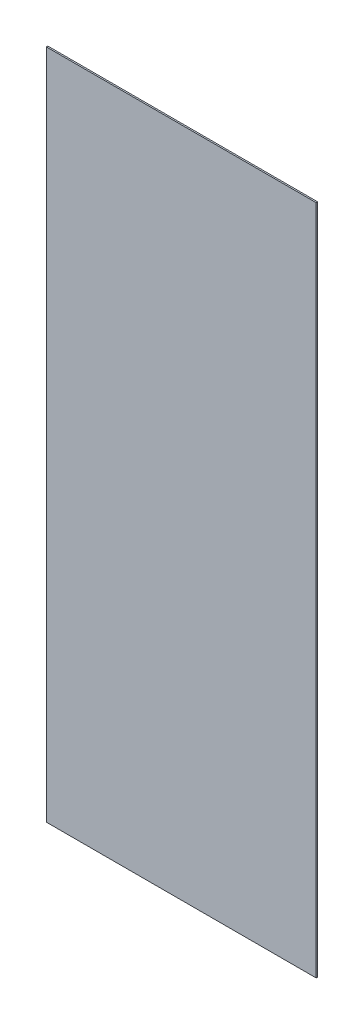
ISO-10303-21;
HEADER;
FILE_DESCRIPTION(('STEP AP214'),'2;1');
FILE_NAME('part.step','',(''),(''),'','','');
FILE_SCHEMA(('AUTOMOTIVE_DESIGN { 1 0 10303 214 1 1 1 1 }'));
ENDSEC;
DATA;
#1=APPLICATION_CONTEXT('core data for automotive mechanical design processes');
#2=APPLICATION_PROTOCOL_DEFINITION('international standard','automotive_design',2000,#1);
#3=PRODUCT_CONTEXT('',#1,'mechanical');
#4=PRODUCT('Part','Part','',(#3));
#5=PRODUCT_RELATED_PRODUCT_CATEGORY('part','',(#4));
#6=PRODUCT_DEFINITION_FORMATION('','',#4);
#7=PRODUCT_DEFINITION_CONTEXT('part definition',#1,'design');
#8=PRODUCT_DEFINITION('design','',#6,#7);
#9=PRODUCT_DEFINITION_SHAPE('','',#8);
#10=(LENGTH_UNIT() NAMED_UNIT(*) SI_UNIT(.MILLI.,.METRE.));
#11=(NAMED_UNIT(*) PLANE_ANGLE_UNIT() SI_UNIT($,.RADIAN.));
#12=(NAMED_UNIT(*) SI_UNIT($,.STERADIAN.) SOLID_ANGLE_UNIT());
#13=UNCERTAINTY_MEASURE_WITH_UNIT(LENGTH_MEASURE(1.E-05),#10,'distance_accuracy_value','');
#14=(GEOMETRIC_REPRESENTATION_CONTEXT(3) GLOBAL_UNCERTAINTY_ASSIGNED_CONTEXT((#13)) GLOBAL_UNIT_ASSIGNED_CONTEXT((#10,
#11,#12)) REPRESENTATION_CONTEXT('',''));
#15=CARTESIAN_POINT('',(0.,0.,0.));
#16=DIRECTION('',(0.,0.,1.));
#17=DIRECTION('',(1.,0.,0.));
#18=AXIS2_PLACEMENT_3D('',#15,#16,#17);
#19=CARTESIAN_POINT('',(253.15,629.75,2.75));
#20=DIRECTION('',(-1.,0.,0.));
#21=DIRECTION('',(0.,0.,1.));
#22=AXIS2_PLACEMENT_3D('',#19,#20,#21);
#23=PLANE('',#22);
#24=DIRECTION('',(0.,1.,0.));
#25=VECTOR('',#24,1.);
#26=CARTESIAN_POINT('',(253.15,629.75,0.));
#27=LINE('',#26,#25);
#28=CARTESIAN_POINT('',(253.15,-629.75,0.));
#29=VERTEX_POINT('',#28);
#30=CARTESIAN_POINT('',(253.15,629.75,0.));
#31=VERTEX_POINT('',#30);
#32=EDGE_CURVE('E94',#29,#31,#27,.T.);
#33=ORIENTED_EDGE('',*,*,#32,.T.);
#34=DIRECTION('',(0.,0.,-1.));
#35=VECTOR('',#34,1.);
#36=CARTESIAN_POINT('',(253.15,629.75,2.75));
#37=LINE('',#36,#35);
#38=CARTESIAN_POINT('',(253.15,629.75,2.75));
#39=VERTEX_POINT('',#38);
#40=EDGE_CURVE('E11',#39,#31,#37,.T.);
#41=ORIENTED_EDGE('',*,*,#40,.F.);
#42=DIRECTION('',(0.,1.,0.));
#43=VECTOR('',#42,1.);
#44=CARTESIAN_POINT('',(253.15,629.75,2.75));
#45=LINE('',#44,#43);
#46=CARTESIAN_POINT('',(253.15,-629.75,2.75));
#47=VERTEX_POINT('',#46);
#48=EDGE_CURVE('E82',#47,#39,#45,.T.);
#49=ORIENTED_EDGE('',*,*,#48,.F.);
#50=DIRECTION('',(0.,0.,-1.));
#51=VECTOR('',#50,1.);
#52=CARTESIAN_POINT('',(253.15,-629.75,2.75));
#53=LINE('',#52,#51);
#54=EDGE_CURVE('E90',#47,#29,#53,.T.);
#55=ORIENTED_EDGE('',*,*,#54,.T.);
#56=EDGE_LOOP('',(#33,#41,#49,#55));
#57=FACE_BOUND('',#56,.T.);
#58=ADVANCED_FACE('F31',(#57),#23,.F.);
#59=CARTESIAN_POINT('',(-253.15,629.75,2.75));
#60=DIRECTION('',(0.,-1.,0.));
#61=DIRECTION('',(0.,0.,-1.));
#62=AXIS2_PLACEMENT_3D('',#59,#60,#61);
#63=PLANE('',#62);
#64=DIRECTION('',(-1.,0.,0.));
#65=VECTOR('',#64,1.);
#66=CARTESIAN_POINT('',(-253.15,629.75,0.));
#67=LINE('',#66,#65);
#68=CARTESIAN_POINT('',(-253.15,629.75,0.));
#69=VERTEX_POINT('',#68);
#70=EDGE_CURVE('E86',#31,#69,#67,.T.);
#71=ORIENTED_EDGE('',*,*,#70,.T.);
#72=DIRECTION('',(0.,0.,-1.));
#73=VECTOR('',#72,1.);
#74=CARTESIAN_POINT('',(-253.15,629.75,2.75));
#75=LINE('',#74,#73);
#76=CARTESIAN_POINT('',(-253.15,629.75,2.75));
#77=VERTEX_POINT('',#76);
#78=EDGE_CURVE('E39',#77,#69,#75,.T.);
#79=ORIENTED_EDGE('',*,*,#78,.F.);
#80=DIRECTION('',(-1.,0.,0.));
#81=VECTOR('',#80,1.);
#82=CARTESIAN_POINT('',(-253.15,629.75,2.75));
#83=LINE('',#82,#81);
#84=EDGE_CURVE('E77',#39,#77,#83,.T.);
#85=ORIENTED_EDGE('',*,*,#84,.F.);
#86=ORIENTED_EDGE('',*,*,#40,.T.);
#87=EDGE_LOOP('',(#71,#79,#85,#86));
#88=FACE_BOUND('',#87,.T.);
#89=ADVANCED_FACE('F85',(#88),#63,.F.);
#90=CARTESIAN_POINT('',(-253.15,629.75,2.75));
#91=DIRECTION('',(1.,0.,0.));
#92=DIRECTION('',(0.,1.,0.));
#93=AXIS2_PLACEMENT_3D('',#90,#91,#92);
#94=PLANE('',#93);
#95=DIRECTION('',(0.,-1.,0.));
#96=VECTOR('',#95,1.);
#97=CARTESIAN_POINT('',(-253.15,629.75,0.));
#98=LINE('',#97,#96);
#99=CARTESIAN_POINT('',(-253.15,-629.75,0.));
#100=VERTEX_POINT('',#99);
#101=EDGE_CURVE('E64',#69,#100,#98,.T.);
#102=ORIENTED_EDGE('',*,*,#101,.T.);
#103=DIRECTION('',(0.,0.,-1.));
#104=VECTOR('',#103,1.);
#105=CARTESIAN_POINT('',(-253.15,-629.75,2.75));
#106=LINE('',#105,#104);
#107=CARTESIAN_POINT('',(-253.15,-629.75,2.75));
#108=VERTEX_POINT('',#107);
#109=EDGE_CURVE('E87',#108,#100,#106,.T.);
#110=ORIENTED_EDGE('',*,*,#109,.F.);
#111=DIRECTION('',(0.,-1.,0.));
#112=VECTOR('',#111,1.);
#113=CARTESIAN_POINT('',(-253.15,629.75,2.75));
#114=LINE('',#113,#112);
#115=EDGE_CURVE('E80',#77,#108,#114,.T.);
#116=ORIENTED_EDGE('',*,*,#115,.F.);
#117=ORIENTED_EDGE('',*,*,#78,.T.);
#118=EDGE_LOOP('',(#102,#110,#116,#117));
#119=FACE_BOUND('',#118,.T.);
#120=ADVANCED_FACE('F88',(#119),#94,.F.);
#121=CARTESIAN_POINT('',(-253.15,-629.75,2.75));
#122=DIRECTION('',(0.,1.,0.));
#123=DIRECTION('',(0.,0.,1.));
#124=AXIS2_PLACEMENT_3D('',#121,#122,#123);
#125=PLANE('',#124);
#126=DIRECTION('',(1.,0.,0.));
#127=VECTOR('',#126,1.);
#128=CARTESIAN_POINT('',(-253.15,-629.75,0.));
#129=LINE('',#128,#127);
#130=EDGE_CURVE('E70',#100,#29,#129,.T.);
#131=ORIENTED_EDGE('',*,*,#130,.T.);
#132=ORIENTED_EDGE('',*,*,#54,.F.);
#133=DIRECTION('',(1.,0.,0.));
#134=VECTOR('',#133,1.);
#135=CARTESIAN_POINT('',(-253.15,-629.75,2.75));
#136=LINE('',#135,#134);
#137=EDGE_CURVE('E47',#108,#47,#136,.T.);
#138=ORIENTED_EDGE('',*,*,#137,.F.);
#139=ORIENTED_EDGE('',*,*,#109,.T.);
#140=EDGE_LOOP('',(#131,#132,#138,#139));
#141=FACE_BOUND('',#140,.T.);
#142=ADVANCED_FACE('F101',(#141),#125,.F.);
#143=CARTESIAN_POINT('',(0.,0.,2.75));
#144=DIRECTION('',(0.,0.,1.));
#145=DIRECTION('',(1.,0.,0.));
#146=AXIS2_PLACEMENT_3D('',#143,#144,#145);
#147=PLANE('',#146);
#148=ORIENTED_EDGE('',*,*,#48,.T.);
#149=ORIENTED_EDGE('',*,*,#84,.T.);
#150=ORIENTED_EDGE('',*,*,#115,.T.);
#151=ORIENTED_EDGE('',*,*,#137,.T.);
#152=EDGE_LOOP('',(#148,#149,#150,#151));
#153=FACE_BOUND('',#152,.T.);
#154=ADVANCED_FACE('F78',(#153),#147,.T.);
#155=CARTESIAN_POINT('',(0.,0.,0.));
#156=DIRECTION('',(0.,0.,1.));
#157=DIRECTION('',(1.,0.,0.));
#158=AXIS2_PLACEMENT_3D('',#155,#156,#157);
#159=PLANE('',#158);
#160=ORIENTED_EDGE('',*,*,#32,.F.);
#161=ORIENTED_EDGE('',*,*,#130,.F.);
#162=ORIENTED_EDGE('',*,*,#101,.F.);
#163=ORIENTED_EDGE('',*,*,#70,.F.);
#164=EDGE_LOOP('',(#160,#161,#162,#163));
#165=FACE_BOUND('',#164,.T.);
#166=ADVANCED_FACE('F104',(#165),#159,.F.);
#167=CLOSED_SHELL('',(#58,#89,#120,#142,#154,#166));
#168=MANIFOLD_SOLID_BREP('B2',#167);
#169=ADVANCED_BREP_SHAPE_REPRESENTATION('',(#18,#168),#14);
#170=SHAPE_DEFINITION_REPRESENTATION(#9,#169);
ENDSEC;
END-ISO-10303-21;
